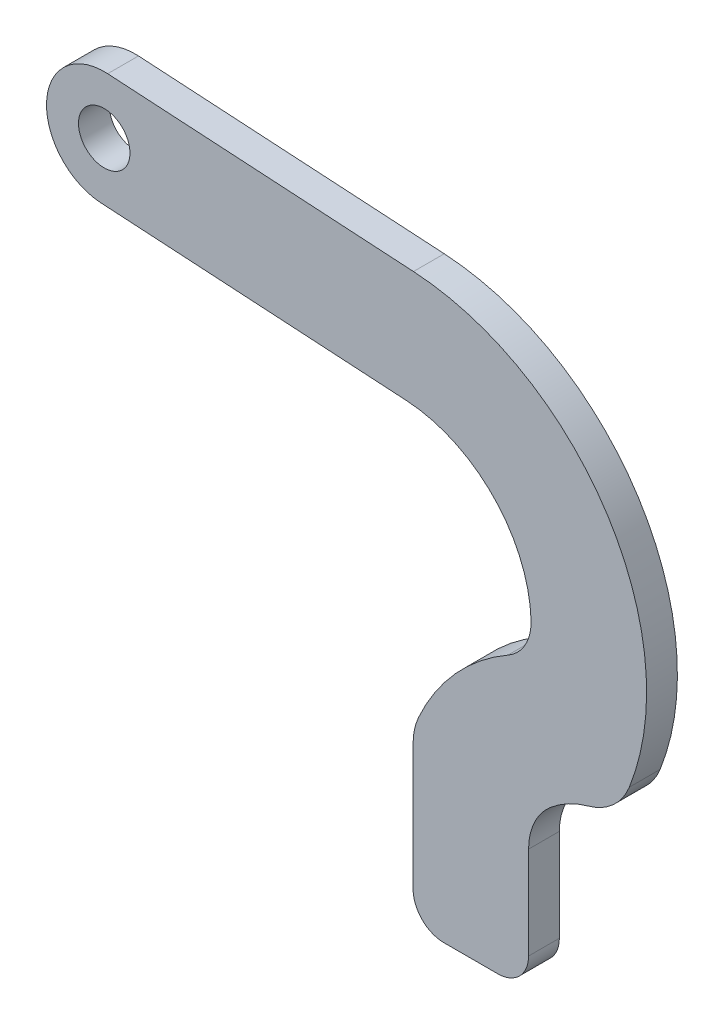
ISO-10303-21;
HEADER;
FILE_DESCRIPTION(('STEP AP214'),'2;1');
FILE_NAME('part.step','',(''),(''),'','','');
FILE_SCHEMA(('AUTOMOTIVE_DESIGN { 1 0 10303 214 1 1 1 1 }'));
ENDSEC;
DATA;
#1=APPLICATION_CONTEXT('core data for automotive mechanical design processes');
#2=APPLICATION_PROTOCOL_DEFINITION('international standard','automotive_design',2000,#1);
#3=PRODUCT_CONTEXT('',#1,'mechanical');
#4=PRODUCT('Part','Part','',(#3));
#5=PRODUCT_RELATED_PRODUCT_CATEGORY('part','',(#4));
#6=PRODUCT_DEFINITION_FORMATION('','',#4);
#7=PRODUCT_DEFINITION_CONTEXT('part definition',#1,'design');
#8=PRODUCT_DEFINITION('design','',#6,#7);
#9=PRODUCT_DEFINITION_SHAPE('','',#8);
#10=(LENGTH_UNIT() NAMED_UNIT(*) SI_UNIT(.MILLI.,.METRE.));
#11=(NAMED_UNIT(*) PLANE_ANGLE_UNIT() SI_UNIT($,.RADIAN.));
#12=(NAMED_UNIT(*) SI_UNIT($,.STERADIAN.) SOLID_ANGLE_UNIT());
#13=UNCERTAINTY_MEASURE_WITH_UNIT(LENGTH_MEASURE(1.E-05),#10,'distance_accuracy_value','');
#14=(GEOMETRIC_REPRESENTATION_CONTEXT(3) GLOBAL_UNCERTAINTY_ASSIGNED_CONTEXT((#13)) GLOBAL_UNIT_ASSIGNED_CONTEXT((#10,
#11,#12)) REPRESENTATION_CONTEXT('',''));
#15=CARTESIAN_POINT('',(0.,0.,0.));
#16=DIRECTION('',(0.,0.,1.));
#17=DIRECTION('',(1.,0.,0.));
#18=AXIS2_PLACEMENT_3D('',#15,#16,#17);
#19=CARTESIAN_POINT('',(1505.49474030049,41.8191411961036,-31.75));
#20=DIRECTION('',(0.,0.,1.));
#21=DIRECTION('',(1.,0.,0.));
#22=AXIS2_PLACEMENT_3D('',#19,#20,#21);
#23=PLANE('',#22);
#24=DIRECTION('',(0.998188747596535,-0.0601599881288317,0.));
#25=VECTOR('',#24,1.);
#26=CARTESIAN_POINT('',(1379.18465700522,86.4661898940818,-31.75));
#27=LINE('',#26,#25);
#28=CARTESIAN_POINT('',(1379.18465700522,86.4661898940818,-31.75));
#29=VERTEX_POINT('',#28);
#30=CARTESIAN_POINT('',(1505.31524174855,78.8644066650965,-31.75));
#31=VERTEX_POINT('',#30);
#32=EDGE_CURVE('E145',#29,#31,#27,.T.);
#33=ORIENTED_EDGE('',*,*,#32,.F.);
#34=CARTESIAN_POINT('',(1380.61736952891,110.238094845643,-31.75));
#35=DIRECTION('',(0.,0.,-1.));
#36=DIRECTION('',(-1.,0.,0.));
#37=AXIS2_PLACEMENT_3D('',#34,#35,#36);
#38=CIRCLE('',#37,23.81504);
#39=CARTESIAN_POINT('',(1382.0500820526,134.009999797205,-31.75));
#40=VERTEX_POINT('',#39);
#41=EDGE_CURVE('E211',#40,#29,#38,.F.);
#42=ORIENTED_EDGE('',*,*,#41,.F.);
#43=DIRECTION('',(-0.998188747596535,0.0601599881288315,0.));
#44=VECTOR('',#43,1.);
#45=CARTESIAN_POINT('',(1508.18066679592,126.408216568219,-31.75));
#46=LINE('',#45,#44);
#47=CARTESIAN_POINT('',(1508.18066679592,126.408216568219,-31.75));
#48=VERTEX_POINT('',#47);
#49=EDGE_CURVE('E157',#48,#40,#46,.T.);
#50=ORIENTED_EDGE('',*,*,#49,.F.);
#51=CARTESIAN_POINT('',(1502.02455003006,24.2644716024553,-31.75));
#52=DIRECTION('',(0.,0.,-1.));
#53=DIRECTION('',(-1.,0.,0.));
#54=AXIS2_PLACEMENT_3D('',#51,#52,#53);
#55=CIRCLE('',#54,102.32908877375);
#56=CARTESIAN_POINT('',(1597.20033423208,-13.3229266953492,-31.75));
#57=VERTEX_POINT('',#56);
#58=EDGE_CURVE('E215',#57,#48,#55,.F.);
#59=ORIENTED_EDGE('',*,*,#58,.F.);
#60=CARTESIAN_POINT('',(1573.57591865581,-3.99302912462892,-31.75));
#61=DIRECTION('',(0.,0.,-1.));
#62=DIRECTION('',(-1.,0.,0.));
#63=AXIS2_PLACEMENT_3D('',#60,#61,#62);
#64=CIRCLE('',#63,25.3999999999999);
#65=CARTESIAN_POINT('',(1580.37520761762,-28.4660687726559,-31.75));
#66=VERTEX_POINT('',#65);
#67=EDGE_CURVE('E219',#66,#57,#64,.F.);
#68=ORIENTED_EDGE('',*,*,#67,.F.);
#69=CARTESIAN_POINT('',(1591.44488230068,-68.3097331515668,-31.75));
#70=DIRECTION('',(0.,0.,-1.));
#71=DIRECTION('',(-1.,0.,0.));
#72=AXIS2_PLACEMENT_3D('',#69,#70,#71);
#73=CIRCLE('',#72,41.352814761854);
#74=CARTESIAN_POINT('',(1564.51146186484,-36.9306612667203,-31.75));
#75=VERTEX_POINT('',#74);
#76=EDGE_CURVE('E223',#75,#66,#73,.T.);
#77=ORIENTED_EDGE('',*,*,#76,.F.);
#78=CARTESIAN_POINT('',(1581.05468589953,-56.2045228034788,-31.75));
#79=DIRECTION('',(0.,0.,-1.));
#80=DIRECTION('',(-1.,0.,0.));
#81=AXIS2_PLACEMENT_3D('',#78,#79,#80);
#82=CIRCLE('',#81,25.4000000000003);
#83=CARTESIAN_POINT('',(1555.65468589953,-56.2045228034786,-31.75));
#84=VERTEX_POINT('',#83);
#85=EDGE_CURVE('E227',#84,#75,#82,.T.);
#86=ORIENTED_EDGE('',*,*,#85,.F.);
#87=DIRECTION('',(0.,1.,0.));
#88=VECTOR('',#87,1.);
#89=CARTESIAN_POINT('',(1555.65468589953,-94.3959408424214,-31.75));
#90=LINE('',#89,#88);
#91=CARTESIAN_POINT('',(1555.65468589953,-94.3959408424214,-31.75));
#92=VERTEX_POINT('',#91);
#93=EDGE_CURVE('E162',#92,#84,#90,.T.);
#94=ORIENTED_EDGE('',*,*,#93,.F.);
#95=CARTESIAN_POINT('',(1542.95468589953,-94.3959408424214,-31.75));
#96=DIRECTION('',(0.,0.,-1.));
#97=DIRECTION('',(-1.,0.,0.));
#98=AXIS2_PLACEMENT_3D('',#95,#96,#97);
#99=CIRCLE('',#98,12.7);
#100=CARTESIAN_POINT('',(1542.95468589953,-107.095940842421,-31.75));
#101=VERTEX_POINT('',#100);
#102=EDGE_CURVE('E230',#101,#92,#99,.F.);
#103=ORIENTED_EDGE('',*,*,#102,.F.);
#104=DIRECTION('',(1.,0.,0.));
#105=VECTOR('',#104,1.);
#106=CARTESIAN_POINT('',(1520.72460589953,-107.095940842421,-31.75));
#107=LINE('',#106,#105);
#108=CARTESIAN_POINT('',(1520.72460589953,-107.095940842421,-31.75));
#109=VERTEX_POINT('',#108);
#110=EDGE_CURVE('E167',#109,#101,#107,.T.);
#111=ORIENTED_EDGE('',*,*,#110,.F.);
#112=CARTESIAN_POINT('',(1520.72460589953,-94.3959408424214,-31.75));
#113=DIRECTION('',(0.,0.,-1.));
#114=DIRECTION('',(-1.,0.,0.));
#115=AXIS2_PLACEMENT_3D('',#112,#113,#114);
#116=CIRCLE('',#115,12.7);
#117=CARTESIAN_POINT('',(1508.02460589953,-94.3959408424214,-31.75));
#118=VERTEX_POINT('',#117);
#119=EDGE_CURVE('E233',#118,#109,#116,.F.);
#120=ORIENTED_EDGE('',*,*,#119,.F.);
#121=DIRECTION('',(0.,1.,0.));
#122=VECTOR('',#121,1.);
#123=CARTESIAN_POINT('',(1508.02460589953,-42.301426158765,-31.75));
#124=LINE('',#123,#122);
#125=CARTESIAN_POINT('',(1508.02460589953,-42.3014261587664,-31.75));
#126=VERTEX_POINT('',#125);
#127=EDGE_CURVE('E172',#126,#118,#124,.F.);
#128=ORIENTED_EDGE('',*,*,#127,.F.);
#129=CARTESIAN_POINT('',(1533.42460589953,-42.3014261587678,-31.75));
#130=DIRECTION('',(0.,0.,-1.));
#131=DIRECTION('',(-1.,0.,0.));
#132=AXIS2_PLACEMENT_3D('',#129,#130,#131);
#133=CIRCLE('',#132,25.3999999999995);
#134=CARTESIAN_POINT('',(1510.24675238863,-31.911666458591,-31.75));
#135=VERTEX_POINT('',#134);
#136=EDGE_CURVE('E236',#135,#126,#133,.F.);
#137=ORIENTED_EDGE('',*,*,#136,.F.);
#138=CARTESIAN_POINT('',(1591.44488230068,-68.3097331515716,-31.75));
#139=DIRECTION('',(0.,0.,-1.));
#140=DIRECTION('',(-1.,0.,0.));
#141=AXIS2_PLACEMENT_3D('',#138,#139,#140);
#142=CIRCLE('',#141,88.9828947618563);
#143=CARTESIAN_POINT('',(1547.14094093908,8.85966713136547,-31.75));
#144=VERTEX_POINT('',#143);
#145=EDGE_CURVE('E133',#144,#135,#142,.F.);
#146=ORIENTED_EDGE('',*,*,#145,.F.);
#147=CARTESIAN_POINT('',(1537.65608336958,25.3805622913206,-31.75));
#148=DIRECTION('',(0.,0.,-1.));
#149=DIRECTION('',(-1.,0.,0.));
#150=AXIS2_PLACEMENT_3D('',#147,#148,#149);
#151=CIRCLE('',#150,19.05);
#152=CARTESIAN_POINT('',(1556.69674490454,25.9769751609694,-31.75));
#153=VERTEX_POINT('',#152);
#154=EDGE_CURVE('E130',#153,#144,#151,.T.);
#155=ORIENTED_EDGE('',*,*,#154,.F.);
#156=CARTESIAN_POINT('',(1502.02455003006,24.2644716024554,-31.75));
#157=DIRECTION('',(0.,0.,-1.));
#158=DIRECTION('',(-1.,0.,0.));
#159=AXIS2_PLACEMENT_3D('',#156,#157,#158);
#160=CIRCLE('',#159,54.6990087737497);
#161=EDGE_CURVE('E127',#31,#153,#160,.T.);
#162=ORIENTED_EDGE('',*,*,#161,.F.);
#163=EDGE_LOOP('',(#33,#42,#50,#59,#68,#77,#86,#94,#103,#111,#120,#128,#137,#146,#155,#162));
#164=FACE_BOUND('',#163,.T.);
#165=CARTESIAN_POINT('',(1380.61736952891,110.238094845643,-31.75));
#166=DIRECTION('',(0.,0.,-1.));
#167=DIRECTION('',(-1.,0.,0.));
#168=AXIS2_PLACEMENT_3D('',#165,#166,#167);
#169=CIRCLE('',#168,10.6212965715647);
#170=CARTESIAN_POINT('',(1369.99607295735,110.238094845643,-31.75));
#171=VERTEX_POINT('',#170);
#172=EDGE_CURVE('E19',#171,#171,#169,.F.);
#173=ORIENTED_EDGE('',*,*,#172,.T.);
#174=EDGE_LOOP('',(#173));
#175=FACE_BOUND('',#174,.T.);
#176=ADVANCED_FACE('F16',(#164,#175),#23,.F.);
#177=CARTESIAN_POINT('',(1380.61736952891,110.238094845643,-19.05));
#178=DIRECTION('',(0.,0.,-1.));
#179=DIRECTION('',(-1.,0.,0.));
#180=AXIS2_PLACEMENT_3D('',#177,#178,#179);
#181=CYLINDRICAL_SURFACE('',#180,10.6212965715647);
#182=CARTESIAN_POINT('',(1380.61736952891,110.238094845643,-19.05));
#183=DIRECTION('',(0.,0.,-1.));
#184=DIRECTION('',(-1.,0.,0.));
#185=AXIS2_PLACEMENT_3D('',#182,#183,#184);
#186=CIRCLE('',#185,10.6212965715647);
#187=CARTESIAN_POINT('',(1369.99607295735,110.238094845643,-19.05));
#188=VERTEX_POINT('',#187);
#189=EDGE_CURVE('E208',#188,#188,#186,.T.);
#190=ORIENTED_EDGE('',*,*,#189,.F.);
#191=EDGE_LOOP('',(#190));
#192=FACE_BOUND('',#191,.T.);
#193=ORIENTED_EDGE('',*,*,#172,.F.);
#194=EDGE_LOOP('',(#193));
#195=FACE_BOUND('',#194,.T.);
#196=ADVANCED_FACE('F421',(#192,#195),#181,.F.);
#197=CARTESIAN_POINT('',(1379.18465700522,86.4661898940818,-19.05));
#198=DIRECTION('',(-0.0601599881288317,-0.998188747596535,0.));
#199=DIRECTION('',(0.998188747596535,-0.0601599881288317,0.));
#200=AXIS2_PLACEMENT_3D('',#197,#198,#199);
#201=PLANE('',#200);
#202=DIRECTION('',(0.998188747596535,-0.0601599881288317,0.));
#203=VECTOR('',#202,1.);
#204=CARTESIAN_POINT('',(1379.18465700522,86.4661898940818,-19.05));
#205=LINE('',#204,#203);
#206=CARTESIAN_POINT('',(1379.18465700522,86.4661898940818,-19.05));
#207=VERTEX_POINT('',#206);
#208=CARTESIAN_POINT('',(1505.31524174855,78.8644066650965,-19.05));
#209=VERTEX_POINT('',#208);
#210=EDGE_CURVE('E207',#207,#209,#205,.T.);
#211=ORIENTED_EDGE('',*,*,#210,.F.);
#212=DIRECTION('',(0.,0.,-1.));
#213=VECTOR('',#212,1.);
#214=CARTESIAN_POINT('',(1379.18465700522,86.4661898940818,-19.05));
#215=LINE('',#214,#213);
#216=EDGE_CURVE('E214',#29,#207,#215,.F.);
#217=ORIENTED_EDGE('',*,*,#216,.F.);
#218=ORIENTED_EDGE('',*,*,#32,.T.);
#219=DIRECTION('',(0.,0.,-1.));
#220=VECTOR('',#219,1.);
#221=CARTESIAN_POINT('',(1505.31524174855,78.8644066650965,-19.05));
#222=LINE('',#221,#220);
#223=EDGE_CURVE('E138',#209,#31,#222,.T.);
#224=ORIENTED_EDGE('',*,*,#223,.F.);
#225=EDGE_LOOP('',(#211,#217,#218,#224));
#226=FACE_BOUND('',#225,.T.);
#227=ADVANCED_FACE('F414',(#226),#201,.T.);
#228=CARTESIAN_POINT('',(1502.02455003006,24.2644716024554,-19.05));
#229=DIRECTION('',(0.,0.,-1.));
#230=DIRECTION('',(-1.,0.,0.));
#231=AXIS2_PLACEMENT_3D('',#228,#229,#230);
#232=CYLINDRICAL_SURFACE('',#231,54.6990087737497);
#233=CARTESIAN_POINT('',(1502.02455003006,24.2644716024554,-19.05));
#234=DIRECTION('',(0.,0.,-1.));
#235=DIRECTION('',(-1.,0.,0.));
#236=AXIS2_PLACEMENT_3D('',#233,#234,#235);
#237=CIRCLE('',#236,54.6990087737497);
#238=CARTESIAN_POINT('',(1556.69674490454,25.9769751609694,-19.05));
#239=VERTEX_POINT('',#238);
#240=EDGE_CURVE('E205',#209,#239,#237,.T.);
#241=ORIENTED_EDGE('',*,*,#240,.F.);
#242=ORIENTED_EDGE('',*,*,#223,.T.);
#243=ORIENTED_EDGE('',*,*,#161,.T.);
#244=DIRECTION('',(0.,0.,-1.));
#245=VECTOR('',#244,1.);
#246=CARTESIAN_POINT('',(1556.69674490454,25.9769751609694,-19.05));
#247=LINE('',#246,#245);
#248=EDGE_CURVE('E137',#239,#153,#247,.T.);
#249=ORIENTED_EDGE('',*,*,#248,.F.);
#250=EDGE_LOOP('',(#241,#242,#243,#249));
#251=FACE_BOUND('',#250,.T.);
#252=ADVANCED_FACE('F143',(#251),#232,.F.);
#253=CARTESIAN_POINT('',(1537.65608336958,25.3805622913206,-19.05));
#254=DIRECTION('',(0.,0.,-1.));
#255=DIRECTION('',(-1.,0.,0.));
#256=AXIS2_PLACEMENT_3D('',#253,#254,#255);
#257=CYLINDRICAL_SURFACE('',#256,19.05);
#258=CARTESIAN_POINT('',(1537.65608336958,25.3805622913206,-19.05));
#259=DIRECTION('',(0.,0.,-1.));
#260=DIRECTION('',(-1.,0.,0.));
#261=AXIS2_PLACEMENT_3D('',#258,#259,#260);
#262=CIRCLE('',#261,19.05);
#263=CARTESIAN_POINT('',(1547.14094093908,8.85966713136547,-19.05));
#264=VERTEX_POINT('',#263);
#265=EDGE_CURVE('E148',#239,#264,#262,.T.);
#266=ORIENTED_EDGE('',*,*,#265,.F.);
#267=ORIENTED_EDGE('',*,*,#248,.T.);
#268=ORIENTED_EDGE('',*,*,#154,.T.);
#269=DIRECTION('',(0.,0.,-1.));
#270=VECTOR('',#269,1.);
#271=CARTESIAN_POINT('',(1547.14094093908,8.85966713136549,-19.05));
#272=LINE('',#271,#270);
#273=EDGE_CURVE('E151',#264,#144,#272,.T.);
#274=ORIENTED_EDGE('',*,*,#273,.F.);
#275=EDGE_LOOP('',(#266,#267,#268,#274));
#276=FACE_BOUND('',#275,.T.);
#277=ADVANCED_FACE('F146',(#276),#257,.F.);
#278=CARTESIAN_POINT('',(1591.44488230068,-68.3097331515716,-19.05));
#279=DIRECTION('',(0.,0.,-1.));
#280=DIRECTION('',(-1.,0.,0.));
#281=AXIS2_PLACEMENT_3D('',#278,#279,#280);
#282=CYLINDRICAL_SURFACE('',#281,88.9828947618563);
#283=CARTESIAN_POINT('',(1591.44488230068,-68.3097331515716,-19.05));
#284=DIRECTION('',(0.,0.,-1.));
#285=DIRECTION('',(-1.,0.,0.));
#286=AXIS2_PLACEMENT_3D('',#283,#284,#285);
#287=CIRCLE('',#286,88.9828947618563);
#288=CARTESIAN_POINT('',(1510.24675238863,-31.911666458591,-19.05));
#289=VERTEX_POINT('',#288);
#290=EDGE_CURVE('E201',#264,#289,#287,.F.);
#291=ORIENTED_EDGE('',*,*,#290,.F.);
#292=ORIENTED_EDGE('',*,*,#273,.T.);
#293=ORIENTED_EDGE('',*,*,#145,.T.);
#294=DIRECTION('',(0.,0.,-1.));
#295=VECTOR('',#294,1.);
#296=CARTESIAN_POINT('',(1510.24675238863,-31.9116664585892,-19.05));
#297=LINE('',#296,#295);
#298=EDGE_CURVE('E175',#289,#135,#297,.T.);
#299=ORIENTED_EDGE('',*,*,#298,.F.);
#300=EDGE_LOOP('',(#291,#292,#293,#299));
#301=FACE_BOUND('',#300,.T.);
#302=ADVANCED_FACE('F243',(#301),#282,.T.);
#303=CARTESIAN_POINT('',(1533.42460589953,-42.3014261587678,-19.05));
#304=DIRECTION('',(0.,0.,-1.));
#305=DIRECTION('',(-1.,0.,0.));
#306=AXIS2_PLACEMENT_3D('',#303,#304,#305);
#307=CYLINDRICAL_SURFACE('',#306,25.3999999999995);
#308=CARTESIAN_POINT('',(1533.42460589953,-42.3014261587678,-19.05));
#309=DIRECTION('',(0.,0.,-1.));
#310=DIRECTION('',(-1.,0.,0.));
#311=AXIS2_PLACEMENT_3D('',#308,#309,#310);
#312=CIRCLE('',#311,25.3999999999995);
#313=CARTESIAN_POINT('',(1508.02460589953,-42.3014261587664,-19.05));
#314=VERTEX_POINT('',#313);
#315=EDGE_CURVE('E198',#289,#314,#312,.F.);
#316=ORIENTED_EDGE('',*,*,#315,.F.);
#317=ORIENTED_EDGE('',*,*,#298,.T.);
#318=ORIENTED_EDGE('',*,*,#136,.T.);
#319=DIRECTION('',(0.,0.,1.));
#320=VECTOR('',#319,1.);
#321=CARTESIAN_POINT('',(1508.02460589953,-42.301426158765,-19.05));
#322=LINE('',#321,#320);
#323=EDGE_CURVE('E174',#314,#126,#322,.F.);
#324=ORIENTED_EDGE('',*,*,#323,.F.);
#325=EDGE_LOOP('',(#316,#317,#318,#324));
#326=FACE_BOUND('',#325,.T.);
#327=ADVANCED_FACE('F281',(#326),#307,.T.);
#328=CARTESIAN_POINT('',(1508.02460589953,-42.301426158765,-19.05));
#329=DIRECTION('',(-1.,0.,0.));
#330=DIRECTION('',(0.,0.,1.));
#331=AXIS2_PLACEMENT_3D('',#328,#329,#330);
#332=PLANE('',#331);
#333=DIRECTION('',(0.,1.,0.));
#334=VECTOR('',#333,1.);
#335=CARTESIAN_POINT('',(1508.02460589953,41.8191411961036,-19.05));
#336=LINE('',#335,#334);
#337=CARTESIAN_POINT('',(1508.02460589953,-94.3959408424214,-19.05));
#338=VERTEX_POINT('',#337);
#339=EDGE_CURVE('E197',#314,#338,#336,.F.);
#340=ORIENTED_EDGE('',*,*,#339,.F.);
#341=ORIENTED_EDGE('',*,*,#323,.T.);
#342=ORIENTED_EDGE('',*,*,#127,.T.);
#343=DIRECTION('',(0.,0.,-1.));
#344=VECTOR('',#343,1.);
#345=CARTESIAN_POINT('',(1508.02460589953,-94.3959408424214,-19.05));
#346=LINE('',#345,#344);
#347=EDGE_CURVE('E171',#338,#118,#346,.T.);
#348=ORIENTED_EDGE('',*,*,#347,.F.);
#349=EDGE_LOOP('',(#340,#341,#342,#348));
#350=FACE_BOUND('',#349,.T.);
#351=ADVANCED_FACE('F279',(#350),#332,.T.);
#352=CARTESIAN_POINT('',(1520.72460589953,-94.3959408424214,-19.05));
#353=DIRECTION('',(0.,0.,-1.));
#354=DIRECTION('',(-1.,0.,0.));
#355=AXIS2_PLACEMENT_3D('',#352,#353,#354);
#356=CYLINDRICAL_SURFACE('',#355,12.7);
#357=CARTESIAN_POINT('',(1520.72460589953,-94.3959408424214,-19.05));
#358=DIRECTION('',(0.,0.,-1.));
#359=DIRECTION('',(-1.,0.,0.));
#360=AXIS2_PLACEMENT_3D('',#357,#358,#359);
#361=CIRCLE('',#360,12.7);
#362=CARTESIAN_POINT('',(1520.72460589953,-107.095940842421,-19.05));
#363=VERTEX_POINT('',#362);
#364=EDGE_CURVE('E194',#338,#363,#361,.F.);
#365=ORIENTED_EDGE('',*,*,#364,.F.);
#366=ORIENTED_EDGE('',*,*,#347,.T.);
#367=ORIENTED_EDGE('',*,*,#119,.T.);
#368=DIRECTION('',(0.,0.,1.));
#369=VECTOR('',#368,1.);
#370=CARTESIAN_POINT('',(1520.72460589953,-107.095940842421,-19.05));
#371=LINE('',#370,#369);
#372=EDGE_CURVE('E170',#363,#109,#371,.F.);
#373=ORIENTED_EDGE('',*,*,#372,.F.);
#374=EDGE_LOOP('',(#365,#366,#367,#373));
#375=FACE_BOUND('',#374,.T.);
#376=ADVANCED_FACE('F286',(#375),#356,.T.);
#377=CARTESIAN_POINT('',(1520.72460589953,-107.095940842421,-19.05));
#378=DIRECTION('',(0.,-1.,0.));
#379=DIRECTION('',(1.,0.,0.));
#380=AXIS2_PLACEMENT_3D('',#377,#378,#379);
#381=PLANE('',#380);
#382=DIRECTION('',(1.,0.,0.));
#383=VECTOR('',#382,1.);
#384=CARTESIAN_POINT('',(1505.49474030049,-107.095940842421,-19.05));
#385=LINE('',#384,#383);
#386=CARTESIAN_POINT('',(1542.95468589953,-107.095940842421,-19.05));
#387=VERTEX_POINT('',#386);
#388=EDGE_CURVE('E193',#363,#387,#385,.T.);
#389=ORIENTED_EDGE('',*,*,#388,.F.);
#390=ORIENTED_EDGE('',*,*,#372,.T.);
#391=ORIENTED_EDGE('',*,*,#110,.T.);
#392=DIRECTION('',(0.,0.,-1.));
#393=VECTOR('',#392,1.);
#394=CARTESIAN_POINT('',(1542.95468589953,-107.095940842421,-19.05));
#395=LINE('',#394,#393);
#396=EDGE_CURVE('E166',#387,#101,#395,.T.);
#397=ORIENTED_EDGE('',*,*,#396,.F.);
#398=EDGE_LOOP('',(#389,#390,#391,#397));
#399=FACE_BOUND('',#398,.T.);
#400=ADVANCED_FACE('F288',(#399),#381,.T.);
#401=CARTESIAN_POINT('',(1542.95468589953,-94.3959408424214,-19.05));
#402=DIRECTION('',(0.,0.,-1.));
#403=DIRECTION('',(-1.,0.,0.));
#404=AXIS2_PLACEMENT_3D('',#401,#402,#403);
#405=CYLINDRICAL_SURFACE('',#404,12.7);
#406=CARTESIAN_POINT('',(1542.95468589953,-94.3959408424214,-19.05));
#407=DIRECTION('',(0.,0.,-1.));
#408=DIRECTION('',(-1.,0.,0.));
#409=AXIS2_PLACEMENT_3D('',#406,#407,#408);
#410=CIRCLE('',#409,12.7);
#411=CARTESIAN_POINT('',(1555.65468589953,-94.3959408424214,-19.05));
#412=VERTEX_POINT('',#411);
#413=EDGE_CURVE('E190',#387,#412,#410,.F.);
#414=ORIENTED_EDGE('',*,*,#413,.F.);
#415=ORIENTED_EDGE('',*,*,#396,.T.);
#416=ORIENTED_EDGE('',*,*,#102,.T.);
#417=DIRECTION('',(0.,0.,-1.));
#418=VECTOR('',#417,1.);
#419=CARTESIAN_POINT('',(1555.65468589953,-94.3959408424214,-19.05));
#420=LINE('',#419,#418);
#421=EDGE_CURVE('E165',#412,#92,#420,.T.);
#422=ORIENTED_EDGE('',*,*,#421,.F.);
#423=EDGE_LOOP('',(#414,#415,#416,#422));
#424=FACE_BOUND('',#423,.T.);
#425=ADVANCED_FACE('F310',(#424),#405,.T.);
#426=CARTESIAN_POINT('',(1555.65468589953,-94.3959408424214,-19.05));
#427=DIRECTION('',(1.,0.,0.));
#428=DIRECTION('',(0.,0.,-1.));
#429=AXIS2_PLACEMENT_3D('',#426,#427,#428);
#430=PLANE('',#429);
#431=DIRECTION('',(0.,1.,0.));
#432=VECTOR('',#431,1.);
#433=CARTESIAN_POINT('',(1555.65468589953,41.8191411961036,-19.05));
#434=LINE('',#433,#432);
#435=CARTESIAN_POINT('',(1555.65468589953,-56.2045228034786,-19.05));
#436=VERTEX_POINT('',#435);
#437=EDGE_CURVE('E189',#412,#436,#434,.T.);
#438=ORIENTED_EDGE('',*,*,#437,.F.);
#439=ORIENTED_EDGE('',*,*,#421,.T.);
#440=ORIENTED_EDGE('',*,*,#93,.T.);
#441=DIRECTION('',(0.,0.,-1.));
#442=VECTOR('',#441,1.);
#443=CARTESIAN_POINT('',(1555.65468589953,-56.2045228034783,-19.05));
#444=LINE('',#443,#442);
#445=EDGE_CURVE('E226',#436,#84,#444,.T.);
#446=ORIENTED_EDGE('',*,*,#445,.F.);
#447=EDGE_LOOP('',(#438,#439,#440,#446));
#448=FACE_BOUND('',#447,.T.);
#449=ADVANCED_FACE('F308',(#448),#430,.T.);
#450=CARTESIAN_POINT('',(1581.05468589953,-56.2045228034788,-19.05));
#451=DIRECTION('',(0.,0.,-1.));
#452=DIRECTION('',(-1.,0.,0.));
#453=AXIS2_PLACEMENT_3D('',#450,#451,#452);
#454=CYLINDRICAL_SURFACE('',#453,25.4000000000003);
#455=CARTESIAN_POINT('',(1581.05468589953,-56.2045228034788,-19.05));
#456=DIRECTION('',(0.,0.,-1.));
#457=DIRECTION('',(-1.,0.,0.));
#458=AXIS2_PLACEMENT_3D('',#455,#456,#457);
#459=CIRCLE('',#458,25.4000000000003);
#460=CARTESIAN_POINT('',(1564.51146186484,-36.9306612667203,-19.05));
#461=VERTEX_POINT('',#460);
#462=EDGE_CURVE('E186',#436,#461,#459,.T.);
#463=ORIENTED_EDGE('',*,*,#462,.F.);
#464=ORIENTED_EDGE('',*,*,#445,.T.);
#465=ORIENTED_EDGE('',*,*,#85,.T.);
#466=DIRECTION('',(0.,0.,-1.));
#467=VECTOR('',#466,1.);
#468=CARTESIAN_POINT('',(1564.51146186485,-36.9306612667149,-19.05));
#469=LINE('',#468,#467);
#470=EDGE_CURVE('E222',#461,#75,#469,.T.);
#471=ORIENTED_EDGE('',*,*,#470,.F.);
#472=EDGE_LOOP('',(#463,#464,#465,#471));
#473=FACE_BOUND('',#472,.T.);
#474=ADVANCED_FACE('F305',(#473),#454,.F.);
#475=CARTESIAN_POINT('',(1591.44488230068,-68.3097331515668,-19.05));
#476=DIRECTION('',(0.,0.,-1.));
#477=DIRECTION('',(-1.,0.,0.));
#478=AXIS2_PLACEMENT_3D('',#475,#476,#477);
#479=CYLINDRICAL_SURFACE('',#478,41.352814761854);
#480=CARTESIAN_POINT('',(1591.44488230068,-68.3097331515668,-19.05));
#481=DIRECTION('',(0.,0.,-1.));
#482=DIRECTION('',(-1.,0.,0.));
#483=AXIS2_PLACEMENT_3D('',#480,#481,#482);
#484=CIRCLE('',#483,41.352814761854);
#485=CARTESIAN_POINT('',(1580.37520761762,-28.4660687726559,-19.05));
#486=VERTEX_POINT('',#485);
#487=EDGE_CURVE('E183',#461,#486,#484,.T.);
#488=ORIENTED_EDGE('',*,*,#487,.F.);
#489=ORIENTED_EDGE('',*,*,#470,.T.);
#490=ORIENTED_EDGE('',*,*,#76,.T.);
#491=DIRECTION('',(0.,0.,-1.));
#492=VECTOR('',#491,1.);
#493=CARTESIAN_POINT('',(1580.37520761762,-28.4660687726564,-19.05));
#494=LINE('',#493,#492);
#495=EDGE_CURVE('E218',#486,#66,#494,.T.);
#496=ORIENTED_EDGE('',*,*,#495,.F.);
#497=EDGE_LOOP('',(#488,#489,#490,#496));
#498=FACE_BOUND('',#497,.T.);
#499=ADVANCED_FACE('F302',(#498),#479,.F.);
#500=CARTESIAN_POINT('',(1573.57591865581,-3.99302912462892,-19.05));
#501=DIRECTION('',(0.,0.,-1.));
#502=DIRECTION('',(-1.,0.,0.));
#503=AXIS2_PLACEMENT_3D('',#500,#501,#502);
#504=CYLINDRICAL_SURFACE('',#503,25.3999999999999);
#505=CARTESIAN_POINT('',(1573.57591865581,-3.99302912462892,-19.05));
#506=DIRECTION('',(0.,0.,-1.));
#507=DIRECTION('',(-1.,0.,0.));
#508=AXIS2_PLACEMENT_3D('',#505,#506,#507);
#509=CIRCLE('',#508,25.3999999999999);
#510=CARTESIAN_POINT('',(1597.20033423208,-13.3229266953492,-19.05));
#511=VERTEX_POINT('',#510);
#512=EDGE_CURVE('E180',#486,#511,#509,.F.);
#513=ORIENTED_EDGE('',*,*,#512,.F.);
#514=ORIENTED_EDGE('',*,*,#495,.T.);
#515=ORIENTED_EDGE('',*,*,#67,.T.);
#516=DIRECTION('',(0.,0.,-1.));
#517=VECTOR('',#516,1.);
#518=CARTESIAN_POINT('',(1597.20033423208,-13.3229266953492,-19.05));
#519=LINE('',#518,#517);
#520=EDGE_CURVE('E160',#511,#57,#519,.T.);
#521=ORIENTED_EDGE('',*,*,#520,.F.);
#522=EDGE_LOOP('',(#513,#514,#515,#521));
#523=FACE_BOUND('',#522,.T.);
#524=ADVANCED_FACE('F299',(#523),#504,.T.);
#525=CARTESIAN_POINT('',(1502.02455003006,24.2644716024553,-19.05));
#526=DIRECTION('',(0.,0.,-1.));
#527=DIRECTION('',(-1.,0.,0.));
#528=AXIS2_PLACEMENT_3D('',#525,#526,#527);
#529=CYLINDRICAL_SURFACE('',#528,102.32908877375);
#530=CARTESIAN_POINT('',(1502.02455003006,24.2644716024553,-19.05));
#531=DIRECTION('',(0.,0.,-1.));
#532=DIRECTION('',(-1.,0.,0.));
#533=AXIS2_PLACEMENT_3D('',#530,#531,#532);
#534=CIRCLE('',#533,102.32908877375);
#535=CARTESIAN_POINT('',(1508.18066679592,126.408216568219,-19.05));
#536=VERTEX_POINT('',#535);
#537=EDGE_CURVE('E177',#511,#536,#534,.F.);
#538=ORIENTED_EDGE('',*,*,#537,.F.);
#539=ORIENTED_EDGE('',*,*,#520,.T.);
#540=ORIENTED_EDGE('',*,*,#58,.T.);
#541=DIRECTION('',(0.,0.,1.));
#542=VECTOR('',#541,1.);
#543=CARTESIAN_POINT('',(1508.18066679592,126.408216568219,-19.05));
#544=LINE('',#543,#542);
#545=EDGE_CURVE('E159',#536,#48,#544,.F.);
#546=ORIENTED_EDGE('',*,*,#545,.F.);
#547=EDGE_LOOP('',(#538,#539,#540,#546));
#548=FACE_BOUND('',#547,.T.);
#549=ADVANCED_FACE('F296',(#548),#529,.T.);
#550=CARTESIAN_POINT('',(1508.18066679592,126.408216568219,-19.05));
#551=DIRECTION('',(0.0601599881288315,0.998188747596535,0.));
#552=DIRECTION('',(-0.998188747596535,0.0601599881288315,0.));
#553=AXIS2_PLACEMENT_3D('',#550,#551,#552);
#554=PLANE('',#553);
#555=DIRECTION('',(-0.998188747596535,0.0601599881288314,0.));
#556=VECTOR('',#555,1.);
#557=CARTESIAN_POINT('',(1508.18066679592,126.408216568219,-19.05));
#558=LINE('',#557,#556);
#559=CARTESIAN_POINT('',(1382.0500820526,134.009999797205,-19.05));
#560=VERTEX_POINT('',#559);
#561=EDGE_CURVE('E25',#536,#560,#558,.T.);
#562=ORIENTED_EDGE('',*,*,#561,.F.);
#563=ORIENTED_EDGE('',*,*,#545,.T.);
#564=ORIENTED_EDGE('',*,*,#49,.T.);
#565=DIRECTION('',(0.,0.,-1.));
#566=VECTOR('',#565,1.);
#567=CARTESIAN_POINT('',(1382.0500820526,134.009999797205,-19.05));
#568=LINE('',#567,#566);
#569=EDGE_CURVE('E34',#560,#40,#568,.T.);
#570=ORIENTED_EDGE('',*,*,#569,.F.);
#571=EDGE_LOOP('',(#562,#563,#564,#570));
#572=FACE_BOUND('',#571,.T.);
#573=ADVANCED_FACE('F294',(#572),#554,.T.);
#574=CARTESIAN_POINT('',(1380.61736952891,110.238094845643,-19.05));
#575=DIRECTION('',(0.,0.,-1.));
#576=DIRECTION('',(-1.,0.,0.));
#577=AXIS2_PLACEMENT_3D('',#574,#575,#576);
#578=CYLINDRICAL_SURFACE('',#577,23.81504);
#579=CARTESIAN_POINT('',(1380.61736952891,110.238094845643,-19.05));
#580=DIRECTION('',(0.,0.,-1.));
#581=DIRECTION('',(-1.,0.,0.));
#582=AXIS2_PLACEMENT_3D('',#579,#580,#581);
#583=CIRCLE('',#582,23.81504);
#584=EDGE_CURVE('E10',#560,#207,#583,.F.);
#585=ORIENTED_EDGE('',*,*,#584,.F.);
#586=ORIENTED_EDGE('',*,*,#569,.T.);
#587=ORIENTED_EDGE('',*,*,#41,.T.);
#588=ORIENTED_EDGE('',*,*,#216,.T.);
#589=EDGE_LOOP('',(#585,#586,#587,#588));
#590=FACE_BOUND('',#589,.T.);
#591=ADVANCED_FACE('F321',(#590),#578,.T.);
#592=CARTESIAN_POINT('',(1505.49474030049,41.8191411961036,-19.05));
#593=DIRECTION('',(0.,0.,1.));
#594=DIRECTION('',(1.,0.,0.));
#595=AXIS2_PLACEMENT_3D('',#592,#593,#594);
#596=PLANE('',#595);
#597=ORIENTED_EDGE('',*,*,#561,.T.);
#598=ORIENTED_EDGE('',*,*,#584,.T.);
#599=ORIENTED_EDGE('',*,*,#210,.T.);
#600=ORIENTED_EDGE('',*,*,#240,.T.);
#601=ORIENTED_EDGE('',*,*,#265,.T.);
#602=ORIENTED_EDGE('',*,*,#290,.T.);
#603=ORIENTED_EDGE('',*,*,#315,.T.);
#604=ORIENTED_EDGE('',*,*,#339,.T.);
#605=ORIENTED_EDGE('',*,*,#364,.T.);
#606=ORIENTED_EDGE('',*,*,#388,.T.);
#607=ORIENTED_EDGE('',*,*,#413,.T.);
#608=ORIENTED_EDGE('',*,*,#437,.T.);
#609=ORIENTED_EDGE('',*,*,#462,.T.);
#610=ORIENTED_EDGE('',*,*,#487,.T.);
#611=ORIENTED_EDGE('',*,*,#512,.T.);
#612=ORIENTED_EDGE('',*,*,#537,.T.);
#613=EDGE_LOOP('',(#597,#598,#599,#600,#601,#602,#603,#604,#605,#606,#607,#608,#609,#610,#611,#612));
#614=FACE_BOUND('',#613,.T.);
#615=ORIENTED_EDGE('',*,*,#189,.T.);
#616=EDGE_LOOP('',(#615));
#617=FACE_BOUND('',#616,.T.);
#618=ADVANCED_FACE('F247',(#614,#617),#596,.T.);
#619=CLOSED_SHELL('',(#176,#196,#227,#252,#277,#302,#327,#351,#376,#400,#425,#449,#474,#499,
#524,#549,#573,#591,#618));
#620=MANIFOLD_SOLID_BREP('B1',#619);
#621=ADVANCED_BREP_SHAPE_REPRESENTATION('',(#18,#620),#14);
#622=SHAPE_DEFINITION_REPRESENTATION(#9,#621);
ENDSEC;
END-ISO-10303-21;
